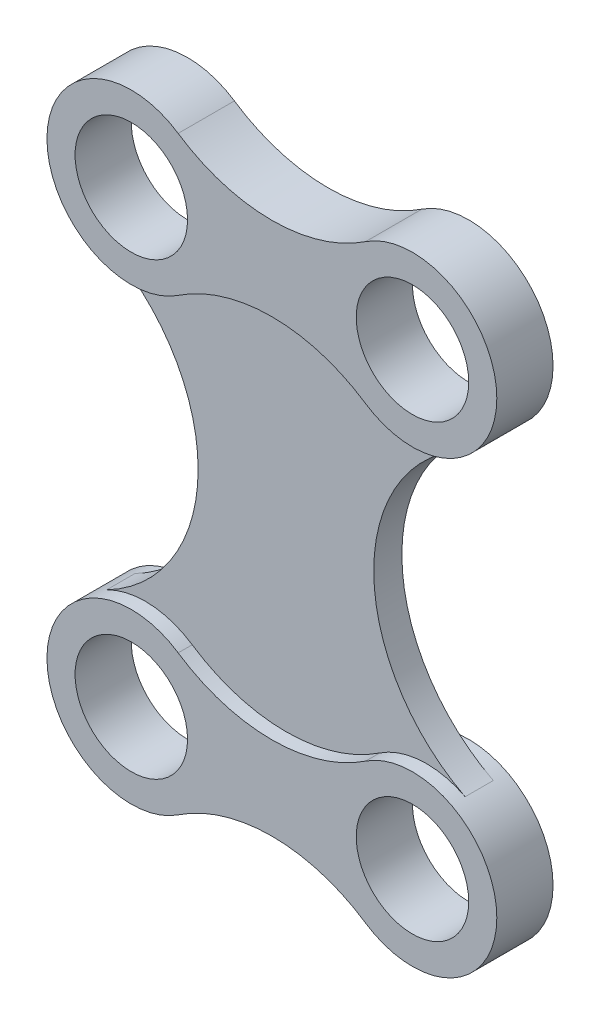
ISO-10303-21;
HEADER;
FILE_DESCRIPTION(('STEP AP214'),'2;1');
FILE_NAME('part.step','',(''),(''),'','','');
FILE_SCHEMA(('AUTOMOTIVE_DESIGN { 1 0 10303 214 1 1 1 1 }'));
ENDSEC;
DATA;
#1=APPLICATION_CONTEXT('core data for automotive mechanical design processes');
#2=APPLICATION_PROTOCOL_DEFINITION('international standard','automotive_design',2000,#1);
#3=PRODUCT_CONTEXT('',#1,'mechanical');
#4=PRODUCT('Part','Part','',(#3));
#5=PRODUCT_RELATED_PRODUCT_CATEGORY('part','',(#4));
#6=PRODUCT_DEFINITION_FORMATION('','',#4);
#7=PRODUCT_DEFINITION_CONTEXT('part definition',#1,'design');
#8=PRODUCT_DEFINITION('design','',#6,#7);
#9=PRODUCT_DEFINITION_SHAPE('','',#8);
#10=(LENGTH_UNIT() NAMED_UNIT(*) SI_UNIT(.MILLI.,.METRE.));
#11=(NAMED_UNIT(*) PLANE_ANGLE_UNIT() SI_UNIT($,.RADIAN.));
#12=(NAMED_UNIT(*) SI_UNIT($,.STERADIAN.) SOLID_ANGLE_UNIT());
#13=UNCERTAINTY_MEASURE_WITH_UNIT(LENGTH_MEASURE(1.E-05),#10,'distance_accuracy_value','');
#14=(GEOMETRIC_REPRESENTATION_CONTEXT(3) GLOBAL_UNCERTAINTY_ASSIGNED_CONTEXT((#13)) GLOBAL_UNIT_ASSIGNED_CONTEXT((#10,
#11,#12)) REPRESENTATION_CONTEXT('',''));
#15=CARTESIAN_POINT('',(0.,0.,0.));
#16=DIRECTION('',(0.,0.,1.));
#17=DIRECTION('',(1.,0.,0.));
#18=AXIS2_PLACEMENT_3D('',#15,#16,#17);
#19=CARTESIAN_POINT('',(0.,2.5834261322606,5.));
#20=DIRECTION('',(0.,0.,-1.));
#21=DIRECTION('',(-1.,0.,0.));
#22=AXIS2_PLACEMENT_3D('',#19,#20,#21);
#23=CYLINDRICAL_SURFACE('',#22,30.);
#24=CARTESIAN_POINT('',(0.,2.5834261322606,-2.5));
#25=DIRECTION('',(0.,0.,1.));
#26=DIRECTION('',(1.,0.,0.));
#27=AXIS2_PLACEMENT_3D('',#24,#25,#26);
#28=CIRCLE('',#27,30.);
#29=CARTESIAN_POINT('',(-16.6666666666667,27.5278087107535,-2.5));
#30=VERTEX_POINT('',#29);
#31=CARTESIAN_POINT('',(16.6666666666667,27.5278087107535,-2.5));
#32=VERTEX_POINT('',#31);
#33=EDGE_CURVE('E265',#30,#32,#28,.F.);
#34=ORIENTED_EDGE('',*,*,#33,.F.);
#35=DIRECTION('',(0.,0.,-1.));
#36=VECTOR('',#35,1.);
#37=CARTESIAN_POINT('',(-16.6666666666667,27.5278087107535,5.));
#38=LINE('',#37,#36);
#39=CARTESIAN_POINT('',(-16.6666666666667,27.5278087107535,-5.));
#40=VERTEX_POINT('',#39);
#41=EDGE_CURVE('E52',#30,#40,#38,.T.);
#42=ORIENTED_EDGE('',*,*,#41,.T.);
#43=CARTESIAN_POINT('',(0.,2.5834261322606,-5.));
#44=DIRECTION('',(0.,0.,1.));
#45=DIRECTION('',(1.,0.,0.));
#46=AXIS2_PLACEMENT_3D('',#43,#44,#45);
#47=CIRCLE('',#46,30.);
#48=CARTESIAN_POINT('',(16.6666666666667,27.5278087107535,-5.));
#49=VERTEX_POINT('',#48);
#50=EDGE_CURVE('E332',#40,#49,#47,.F.);
#51=ORIENTED_EDGE('',*,*,#50,.T.);
#52=DIRECTION('',(0.,0.,-1.));
#53=VECTOR('',#52,1.);
#54=CARTESIAN_POINT('',(16.6666666666667,27.5278087107535,5.));
#55=LINE('',#54,#53);
#56=EDGE_CURVE('E347',#32,#49,#55,.T.);
#57=ORIENTED_EDGE('',*,*,#56,.F.);
#58=EDGE_LOOP('',(#34,#42,#51,#57));
#59=FACE_BOUND('',#58,.T.);
#60=ADVANCED_FACE('F43',(#59),#23,.F.);
#61=CARTESIAN_POINT('',(-25.,40.,5.));
#62=DIRECTION('',(0.,0.,-1.));
#63=DIRECTION('',(-1.,0.,0.));
#64=AXIS2_PLACEMENT_3D('',#61,#62,#63);
#65=CYLINDRICAL_SURFACE('',#64,15.);
#66=DIRECTION('',(0.,0.,-1.));
#67=VECTOR('',#66,1.);
#68=CARTESIAN_POINT('',(-31.8718427093628,26.6666666666667,2.5));
#69=LINE('',#68,#67);
#70=CARTESIAN_POINT('',(-31.8718427093628,26.6666666666667,2.5));
#71=VERTEX_POINT('',#70);
#72=CARTESIAN_POINT('',(-31.8718427093628,26.6666666666667,-2.5));
#73=VERTEX_POINT('',#72);
#74=EDGE_CURVE('E59',#71,#73,#69,.T.);
#75=ORIENTED_EDGE('',*,*,#74,.F.);
#76=CARTESIAN_POINT('',(-25.,40.,2.5));
#77=DIRECTION('',(0.,0.,1.));
#78=DIRECTION('',(1.,0.,0.));
#79=AXIS2_PLACEMENT_3D('',#76,#77,#78);
#80=CIRCLE('',#79,15.);
#81=CARTESIAN_POINT('',(-16.6666666666667,27.5278087107535,2.5));
#82=VERTEX_POINT('',#81);
#83=EDGE_CURVE('E243',#71,#82,#80,.T.);
#84=ORIENTED_EDGE('',*,*,#83,.T.);
#85=CARTESIAN_POINT('',(-16.6666666666667,27.5278087107535,5.));
#86=VERTEX_POINT('',#85);
#87=EDGE_CURVE('E11',#86,#82,#38,.T.);
#88=ORIENTED_EDGE('',*,*,#87,.F.);
#89=CARTESIAN_POINT('',(-25.,40.,5.));
#90=DIRECTION('',(0.,0.,1.));
#91=DIRECTION('',(1.,0.,0.));
#92=AXIS2_PLACEMENT_3D('',#89,#90,#91);
#93=CIRCLE('',#92,15.);
#94=CARTESIAN_POINT('',(-16.6666666666667,52.4721912892465,5.));
#95=VERTEX_POINT('',#94);
#96=EDGE_CURVE('E306',#95,#86,#93,.T.);
#97=ORIENTED_EDGE('',*,*,#96,.F.);
#98=DIRECTION('',(0.,0.,-1.));
#99=VECTOR('',#98,1.);
#100=CARTESIAN_POINT('',(-16.6666666666667,52.4721912892465,5.));
#101=LINE('',#100,#99);
#102=CARTESIAN_POINT('',(-16.6666666666667,52.4721912892465,-5.));
#103=VERTEX_POINT('',#102);
#104=EDGE_CURVE('E320',#95,#103,#101,.T.);
#105=ORIENTED_EDGE('',*,*,#104,.T.);
#106=CARTESIAN_POINT('',(-25.,40.,-5.));
#107=DIRECTION('',(0.,0.,1.));
#108=DIRECTION('',(1.,0.,0.));
#109=AXIS2_PLACEMENT_3D('',#106,#107,#108);
#110=CIRCLE('',#109,15.);
#111=EDGE_CURVE('E328',#103,#40,#110,.T.);
#112=ORIENTED_EDGE('',*,*,#111,.T.);
#113=ORIENTED_EDGE('',*,*,#41,.F.);
#114=CARTESIAN_POINT('',(-25.,40.,-2.5));
#115=DIRECTION('',(0.,0.,1.));
#116=DIRECTION('',(1.,0.,0.));
#117=AXIS2_PLACEMENT_3D('',#114,#115,#116);
#118=CIRCLE('',#117,15.);
#119=EDGE_CURVE('E64',#73,#30,#118,.T.);
#120=ORIENTED_EDGE('',*,*,#119,.F.);
#121=EDGE_LOOP('',(#75,#84,#88,#97,#105,#112,#113,#120));
#122=FACE_BOUND('',#121,.T.);
#123=ADVANCED_FACE('F388',(#122),#65,.T.);
#124=ORIENTED_EDGE('',*,*,#87,.T.);
#125=CARTESIAN_POINT('',(0.,2.5834261322606,2.5));
#126=DIRECTION('',(0.,0.,1.));
#127=DIRECTION('',(1.,0.,0.));
#128=AXIS2_PLACEMENT_3D('',#125,#126,#127);
#129=CIRCLE('',#128,30.);
#130=CARTESIAN_POINT('',(16.6666666666667,27.5278087107535,2.5));
#131=VERTEX_POINT('',#130);
#132=EDGE_CURVE('E240',#82,#131,#129,.F.);
#133=ORIENTED_EDGE('',*,*,#132,.T.);
#134=CARTESIAN_POINT('',(16.6666666666667,27.5278087107535,5.));
#135=VERTEX_POINT('',#134);
#136=EDGE_CURVE('E348',#135,#131,#55,.T.);
#137=ORIENTED_EDGE('',*,*,#136,.F.);
#138=CARTESIAN_POINT('',(0.,2.5834261322606,5.));
#139=DIRECTION('',(0.,0.,1.));
#140=DIRECTION('',(1.,0.,0.));
#141=AXIS2_PLACEMENT_3D('',#138,#139,#140);
#142=CIRCLE('',#141,30.);
#143=EDGE_CURVE('E310',#86,#135,#142,.F.);
#144=ORIENTED_EDGE('',*,*,#143,.F.);
#145=EDGE_LOOP('',(#124,#133,#137,#144));
#146=FACE_BOUND('',#145,.T.);
#147=ADVANCED_FACE('F375',(#146),#23,.F.);
#148=CARTESIAN_POINT('',(25.,40.,5.));
#149=DIRECTION('',(0.,0.,-1.));
#150=DIRECTION('',(-1.,0.,0.));
#151=AXIS2_PLACEMENT_3D('',#148,#149,#150);
#152=CYLINDRICAL_SURFACE('',#151,15.);
#153=ORIENTED_EDGE('',*,*,#136,.T.);
#154=CARTESIAN_POINT('',(25.,40.,2.5));
#155=DIRECTION('',(0.,0.,1.));
#156=DIRECTION('',(1.,0.,0.));
#157=AXIS2_PLACEMENT_3D('',#154,#155,#156);
#158=CIRCLE('',#157,15.);
#159=CARTESIAN_POINT('',(31.8718427093628,26.6666666666667,2.5));
#160=VERTEX_POINT('',#159);
#161=EDGE_CURVE('E236',#131,#160,#158,.T.);
#162=ORIENTED_EDGE('',*,*,#161,.T.);
#163=DIRECTION('',(0.,0.,-1.));
#164=VECTOR('',#163,1.);
#165=CARTESIAN_POINT('',(31.8718427093628,26.6666666666667,2.5));
#166=LINE('',#165,#164);
#167=CARTESIAN_POINT('',(31.8718427093628,26.6666666666667,-2.5));
#168=VERTEX_POINT('',#167);
#169=EDGE_CURVE('E293',#160,#168,#166,.T.);
#170=ORIENTED_EDGE('',*,*,#169,.T.);
#171=CARTESIAN_POINT('',(25.,40.,-2.5));
#172=DIRECTION('',(0.,0.,1.));
#173=DIRECTION('',(1.,0.,0.));
#174=AXIS2_PLACEMENT_3D('',#171,#172,#173);
#175=CIRCLE('',#174,15.);
#176=EDGE_CURVE('E261',#32,#168,#175,.T.);
#177=ORIENTED_EDGE('',*,*,#176,.F.);
#178=ORIENTED_EDGE('',*,*,#56,.T.);
#179=CARTESIAN_POINT('',(25.,40.,-5.));
#180=DIRECTION('',(0.,0.,1.));
#181=DIRECTION('',(1.,0.,0.));
#182=AXIS2_PLACEMENT_3D('',#179,#180,#181);
#183=CIRCLE('',#182,15.);
#184=CARTESIAN_POINT('',(16.6666666666667,52.4721912892465,-5.));
#185=VERTEX_POINT('',#184);
#186=EDGE_CURVE('E336',#49,#185,#183,.T.);
#187=ORIENTED_EDGE('',*,*,#186,.T.);
#188=DIRECTION('',(0.,0.,-1.));
#189=VECTOR('',#188,1.);
#190=CARTESIAN_POINT('',(16.6666666666667,52.4721912892465,5.));
#191=LINE('',#190,#189);
#192=CARTESIAN_POINT('',(16.6666666666667,52.4721912892465,5.));
#193=VERTEX_POINT('',#192);
#194=EDGE_CURVE('E345',#193,#185,#191,.T.);
#195=ORIENTED_EDGE('',*,*,#194,.F.);
#196=CARTESIAN_POINT('',(25.,40.,5.));
#197=DIRECTION('',(0.,0.,1.));
#198=DIRECTION('',(1.,0.,0.));
#199=AXIS2_PLACEMENT_3D('',#196,#197,#198);
#200=CIRCLE('',#199,15.);
#201=EDGE_CURVE('E313',#135,#193,#200,.T.);
#202=ORIENTED_EDGE('',*,*,#201,.F.);
#203=EDGE_LOOP('',(#153,#162,#170,#177,#178,#187,#195,#202));
#204=FACE_BOUND('',#203,.T.);
#205=ADVANCED_FACE('F358',(#204),#152,.T.);
#206=CARTESIAN_POINT('',(25.,40.,5.));
#207=DIRECTION('',(0.,0.,-1.));
#208=DIRECTION('',(-1.,0.,0.));
#209=AXIS2_PLACEMENT_3D('',#206,#207,#208);
#210=CYLINDRICAL_SURFACE('',#209,10.);
#211=CARTESIAN_POINT('',(25.,40.,5.));
#212=DIRECTION('',(0.,0.,1.));
#213=DIRECTION('',(1.,0.,0.));
#214=AXIS2_PLACEMENT_3D('',#211,#212,#213);
#215=CIRCLE('',#214,10.);
#216=CARTESIAN_POINT('',(35.,40.,5.));
#217=VERTEX_POINT('',#216);
#218=EDGE_CURVE('E301',#217,#217,#215,.T.);
#219=ORIENTED_EDGE('',*,*,#218,.T.);
#220=EDGE_LOOP('',(#219));
#221=FACE_BOUND('',#220,.T.);
#222=CARTESIAN_POINT('',(25.,40.,-5.));
#223=DIRECTION('',(0.,0.,1.));
#224=DIRECTION('',(1.,0.,0.));
#225=AXIS2_PLACEMENT_3D('',#222,#223,#224);
#226=CIRCLE('',#225,10.);
#227=CARTESIAN_POINT('',(35.,40.,-5.));
#228=VERTEX_POINT('',#227);
#229=EDGE_CURVE('E324',#228,#228,#226,.T.);
#230=ORIENTED_EDGE('',*,*,#229,.F.);
#231=EDGE_LOOP('',(#230));
#232=FACE_BOUND('',#231,.T.);
#233=ADVANCED_FACE('F397',(#221,#232),#210,.F.);
#234=CARTESIAN_POINT('',(-25.,40.,5.));
#235=DIRECTION('',(0.,0.,-1.));
#236=DIRECTION('',(-1.,0.,0.));
#237=AXIS2_PLACEMENT_3D('',#234,#235,#236);
#238=CYLINDRICAL_SURFACE('',#237,10.);
#239=CARTESIAN_POINT('',(-25.,40.,5.));
#240=DIRECTION('',(0.,0.,1.));
#241=DIRECTION('',(1.,0.,0.));
#242=AXIS2_PLACEMENT_3D('',#239,#240,#241);
#243=CIRCLE('',#242,10.);
#244=CARTESIAN_POINT('',(-15.,40.,5.));
#245=VERTEX_POINT('',#244);
#246=EDGE_CURVE('E297',#245,#245,#243,.T.);
#247=ORIENTED_EDGE('',*,*,#246,.T.);
#248=EDGE_LOOP('',(#247));
#249=FACE_BOUND('',#248,.T.);
#250=CARTESIAN_POINT('',(-25.,40.,-5.));
#251=DIRECTION('',(0.,0.,1.));
#252=DIRECTION('',(1.,0.,0.));
#253=AXIS2_PLACEMENT_3D('',#250,#251,#252);
#254=CIRCLE('',#253,10.);
#255=CARTESIAN_POINT('',(-15.,40.,-5.));
#256=VERTEX_POINT('',#255);
#257=EDGE_CURVE('E296',#256,#256,#254,.T.);
#258=ORIENTED_EDGE('',*,*,#257,.F.);
#259=EDGE_LOOP('',(#258));
#260=FACE_BOUND('',#259,.T.);
#261=ADVANCED_FACE('F45',(#249,#260),#238,.F.);
#262=CARTESIAN_POINT('',(0.,77.4165738677394,5.));
#263=DIRECTION('',(0.,0.,-1.));
#264=DIRECTION('',(-1.,0.,0.));
#265=AXIS2_PLACEMENT_3D('',#262,#263,#264);
#266=CYLINDRICAL_SURFACE('',#265,30.);
#267=CARTESIAN_POINT('',(0.,77.4165738677394,-5.));
#268=DIRECTION('',(0.,0.,1.));
#269=DIRECTION('',(1.,0.,0.));
#270=AXIS2_PLACEMENT_3D('',#267,#268,#269);
#271=CIRCLE('',#270,30.);
#272=EDGE_CURVE('E302',#103,#185,#271,.T.);
#273=ORIENTED_EDGE('',*,*,#272,.F.);
#274=ORIENTED_EDGE('',*,*,#104,.F.);
#275=CARTESIAN_POINT('',(0.,77.4165738677394,5.));
#276=DIRECTION('',(0.,0.,1.));
#277=DIRECTION('',(1.,0.,0.));
#278=AXIS2_PLACEMENT_3D('',#275,#276,#277);
#279=CIRCLE('',#278,30.);
#280=EDGE_CURVE('E316',#95,#193,#279,.T.);
#281=ORIENTED_EDGE('',*,*,#280,.T.);
#282=ORIENTED_EDGE('',*,*,#194,.T.);
#283=EDGE_LOOP('',(#273,#274,#281,#282));
#284=FACE_BOUND('',#283,.T.);
#285=ADVANCED_FACE('F368',(#284),#266,.F.);
#286=CARTESIAN_POINT('',(0.,0.,5.));
#287=DIRECTION('',(0.,0.,1.));
#288=DIRECTION('',(1.,0.,0.));
#289=AXIS2_PLACEMENT_3D('',#286,#287,#288);
#290=PLANE('',#289);
#291=ORIENTED_EDGE('',*,*,#246,.F.);
#292=EDGE_LOOP('',(#291));
#293=FACE_BOUND('',#292,.T.);
#294=ORIENTED_EDGE('',*,*,#218,.F.);
#295=EDGE_LOOP('',(#294));
#296=FACE_BOUND('',#295,.T.);
#297=ORIENTED_EDGE('',*,*,#96,.T.);
#298=ORIENTED_EDGE('',*,*,#143,.T.);
#299=ORIENTED_EDGE('',*,*,#201,.T.);
#300=ORIENTED_EDGE('',*,*,#280,.F.);
#301=EDGE_LOOP('',(#297,#298,#299,#300));
#302=FACE_BOUND('',#301,.T.);
#303=ADVANCED_FACE('F372',(#293,#296,#302),#290,.T.);
#304=CARTESIAN_POINT('',(0.,0.,-5.));
#305=DIRECTION('',(0.,0.,1.));
#306=DIRECTION('',(1.,0.,0.));
#307=AXIS2_PLACEMENT_3D('',#304,#305,#306);
#308=PLANE('',#307);
#309=ORIENTED_EDGE('',*,*,#257,.T.);
#310=EDGE_LOOP('',(#309));
#311=FACE_BOUND('',#310,.T.);
#312=ORIENTED_EDGE('',*,*,#229,.T.);
#313=EDGE_LOOP('',(#312));
#314=FACE_BOUND('',#313,.T.);
#315=ORIENTED_EDGE('',*,*,#111,.F.);
#316=ORIENTED_EDGE('',*,*,#272,.T.);
#317=ORIENTED_EDGE('',*,*,#186,.F.);
#318=ORIENTED_EDGE('',*,*,#50,.F.);
#319=EDGE_LOOP('',(#315,#316,#317,#318));
#320=FACE_BOUND('',#319,.T.);
#321=ADVANCED_FACE('F365',(#311,#314,#320),#308,.F.);
#322=CARTESIAN_POINT('',(45.6155281280883,0.,2.5));
#323=DIRECTION('',(0.,0.,-1.));
#324=DIRECTION('',(-1.,0.,0.));
#325=AXIS2_PLACEMENT_3D('',#322,#323,#324);
#326=CYLINDRICAL_SURFACE('',#325,30.);
#327=CARTESIAN_POINT('',(45.6155281280883,0.,-2.5));
#328=DIRECTION('',(0.,0.,1.));
#329=DIRECTION('',(1.,0.,0.));
#330=AXIS2_PLACEMENT_3D('',#327,#328,#329);
#331=CIRCLE('',#330,30.);
#332=CARTESIAN_POINT('',(31.8718427093628,-26.6666666666667,-2.5));
#333=VERTEX_POINT('',#332);
#334=EDGE_CURVE('E167',#168,#333,#331,.T.);
#335=ORIENTED_EDGE('',*,*,#334,.F.);
#336=ORIENTED_EDGE('',*,*,#169,.F.);
#337=CARTESIAN_POINT('',(45.6155281280883,0.,2.5));
#338=DIRECTION('',(0.,0.,1.));
#339=DIRECTION('',(1.,0.,0.));
#340=AXIS2_PLACEMENT_3D('',#337,#338,#339);
#341=CIRCLE('',#340,30.);
#342=CARTESIAN_POINT('',(31.8718427093628,-26.6666666666667,2.5));
#343=VERTEX_POINT('',#342);
#344=EDGE_CURVE('E232',#160,#343,#341,.T.);
#345=ORIENTED_EDGE('',*,*,#344,.T.);
#346=DIRECTION('',(0.,0.,-1.));
#347=VECTOR('',#346,1.);
#348=CARTESIAN_POINT('',(31.8718427093628,-26.6666666666667,2.5));
#349=LINE('',#348,#347);
#350=EDGE_CURVE('E257',#343,#333,#349,.T.);
#351=ORIENTED_EDGE('',*,*,#350,.T.);
#352=EDGE_LOOP('',(#335,#336,#345,#351));
#353=FACE_BOUND('',#352,.T.);
#354=ADVANCED_FACE('F384',(#353),#326,.F.);
#355=CARTESIAN_POINT('',(-45.6155281280883,0.,2.5));
#356=DIRECTION('',(0.,0.,-1.));
#357=DIRECTION('',(-1.,0.,0.));
#358=AXIS2_PLACEMENT_3D('',#355,#356,#357);
#359=CYLINDRICAL_SURFACE('',#358,30.);
#360=CARTESIAN_POINT('',(-45.6155281280883,0.,-2.5));
#361=DIRECTION('',(0.,0.,1.));
#362=DIRECTION('',(1.,0.,0.));
#363=AXIS2_PLACEMENT_3D('',#360,#361,#362);
#364=CIRCLE('',#363,30.);
#365=CARTESIAN_POINT('',(-31.8718427093628,-26.6666666666667,-2.5));
#366=VERTEX_POINT('',#365);
#367=EDGE_CURVE('E271',#73,#366,#364,.F.);
#368=ORIENTED_EDGE('',*,*,#367,.T.);
#369=DIRECTION('',(0.,0.,-1.));
#370=VECTOR('',#369,1.);
#371=CARTESIAN_POINT('',(-31.8718427093628,-26.6666666666667,2.5));
#372=LINE('',#371,#370);
#373=CARTESIAN_POINT('',(-31.8718427093628,-26.6666666666667,2.5));
#374=VERTEX_POINT('',#373);
#375=EDGE_CURVE('E287',#374,#366,#372,.T.);
#376=ORIENTED_EDGE('',*,*,#375,.F.);
#377=CARTESIAN_POINT('',(-45.6155281280883,0.,2.5));
#378=DIRECTION('',(0.,0.,1.));
#379=DIRECTION('',(1.,0.,0.));
#380=AXIS2_PLACEMENT_3D('',#377,#378,#379);
#381=CIRCLE('',#380,30.);
#382=EDGE_CURVE('E246',#71,#374,#381,.F.);
#383=ORIENTED_EDGE('',*,*,#382,.F.);
#384=ORIENTED_EDGE('',*,*,#74,.T.);
#385=EDGE_LOOP('',(#368,#376,#383,#384));
#386=FACE_BOUND('',#385,.T.);
#387=ADVANCED_FACE('F416',(#386),#359,.F.);
#388=CARTESIAN_POINT('',(0.,0.,2.5));
#389=DIRECTION('',(0.,0.,1.));
#390=DIRECTION('',(1.,0.,0.));
#391=AXIS2_PLACEMENT_3D('',#388,#389,#390);
#392=PLANE('',#391);
#393=ORIENTED_EDGE('',*,*,#344,.F.);
#394=ORIENTED_EDGE('',*,*,#161,.F.);
#395=ORIENTED_EDGE('',*,*,#132,.F.);
#396=ORIENTED_EDGE('',*,*,#83,.F.);
#397=ORIENTED_EDGE('',*,*,#382,.T.);
#398=CARTESIAN_POINT('',(-25.,-40.,2.5));
#399=DIRECTION('',(0.,0.,1.));
#400=DIRECTION('',(1.,0.,0.));
#401=AXIS2_PLACEMENT_3D('',#398,#399,#400);
#402=CIRCLE('',#401,15.);
#403=CARTESIAN_POINT('',(-16.6666666666667,-27.5278087107535,2.5));
#404=VERTEX_POINT('',#403);
#405=EDGE_CURVE('E249',#374,#404,#402,.F.);
#406=ORIENTED_EDGE('',*,*,#405,.T.);
#407=CARTESIAN_POINT('',(0.,-2.5834261322606,2.5));
#408=DIRECTION('',(0.,0.,1.));
#409=DIRECTION('',(1.,0.,0.));
#410=AXIS2_PLACEMENT_3D('',#407,#408,#409);
#411=CIRCLE('',#410,30.);
#412=CARTESIAN_POINT('',(16.6666666666667,-27.5278087107536,2.5));
#413=VERTEX_POINT('',#412);
#414=EDGE_CURVE('E252',#404,#413,#411,.T.);
#415=ORIENTED_EDGE('',*,*,#414,.T.);
#416=CARTESIAN_POINT('',(25.,-40.,2.5));
#417=DIRECTION('',(0.,0.,1.));
#418=DIRECTION('',(1.,0.,0.));
#419=AXIS2_PLACEMENT_3D('',#416,#417,#418);
#420=CIRCLE('',#419,15.);
#421=EDGE_CURVE('E162',#413,#343,#420,.F.);
#422=ORIENTED_EDGE('',*,*,#421,.T.);
#423=EDGE_LOOP('',(#393,#394,#395,#396,#397,#406,#415,#422));
#424=FACE_BOUND('',#423,.T.);
#425=ADVANCED_FACE('F380',(#424),#392,.T.);
#426=CARTESIAN_POINT('',(0.,0.,-2.5));
#427=DIRECTION('',(0.,0.,1.));
#428=DIRECTION('',(1.,0.,0.));
#429=AXIS2_PLACEMENT_3D('',#426,#427,#428);
#430=PLANE('',#429);
#431=ORIENTED_EDGE('',*,*,#334,.T.);
#432=CARTESIAN_POINT('',(25.,-40.,-2.5));
#433=DIRECTION('',(0.,0.,1.));
#434=DIRECTION('',(1.,0.,0.));
#435=AXIS2_PLACEMENT_3D('',#432,#433,#434);
#436=CIRCLE('',#435,15.);
#437=CARTESIAN_POINT('',(16.6666666666667,-27.5278087107536,-2.5));
#438=VERTEX_POINT('',#437);
#439=EDGE_CURVE('E237',#438,#333,#436,.F.);
#440=ORIENTED_EDGE('',*,*,#439,.F.);
#441=CARTESIAN_POINT('',(0.,-2.5834261322606,-2.5));
#442=DIRECTION('',(0.,0.,1.));
#443=DIRECTION('',(1.,0.,0.));
#444=AXIS2_PLACEMENT_3D('',#441,#442,#443);
#445=CIRCLE('',#444,30.);
#446=CARTESIAN_POINT('',(-16.6666666666667,-27.5278087107535,-2.5));
#447=VERTEX_POINT('',#446);
#448=EDGE_CURVE('E278',#447,#438,#445,.T.);
#449=ORIENTED_EDGE('',*,*,#448,.F.);
#450=CARTESIAN_POINT('',(-25.,-40.,-2.5));
#451=DIRECTION('',(0.,0.,1.));
#452=DIRECTION('',(1.,0.,0.));
#453=AXIS2_PLACEMENT_3D('',#450,#451,#452);
#454=CIRCLE('',#453,15.);
#455=EDGE_CURVE('E274',#366,#447,#454,.F.);
#456=ORIENTED_EDGE('',*,*,#455,.F.);
#457=ORIENTED_EDGE('',*,*,#367,.F.);
#458=ORIENTED_EDGE('',*,*,#119,.T.);
#459=ORIENTED_EDGE('',*,*,#33,.T.);
#460=ORIENTED_EDGE('',*,*,#176,.T.);
#461=EDGE_LOOP('',(#431,#440,#449,#456,#457,#458,#459,#460));
#462=FACE_BOUND('',#461,.T.);
#463=ADVANCED_FACE('F386',(#462),#430,.F.);
#464=CARTESIAN_POINT('',(0.,-2.5834261322606,5.));
#465=DIRECTION('',(0.,0.,-1.));
#466=DIRECTION('',(-1.,0.,0.));
#467=AXIS2_PLACEMENT_3D('',#464,#465,#466);
#468=CYLINDRICAL_SURFACE('',#467,30.);
#469=ORIENTED_EDGE('',*,*,#448,.T.);
#470=DIRECTION('',(0.,0.,-1.));
#471=VECTOR('',#470,1.);
#472=CARTESIAN_POINT('',(16.6666666666667,-27.5278087107536,5.));
#473=LINE('',#472,#471);
#474=CARTESIAN_POINT('',(16.6666666666667,-27.5278087107536,-5.));
#475=VERTEX_POINT('',#474);
#476=EDGE_CURVE('E168',#438,#475,#473,.T.);
#477=ORIENTED_EDGE('',*,*,#476,.T.);
#478=CARTESIAN_POINT('',(0.,-2.5834261322606,-5.));
#479=DIRECTION('',(0.,0.,1.));
#480=DIRECTION('',(1.,0.,0.));
#481=AXIS2_PLACEMENT_3D('',#478,#479,#480);
#482=CIRCLE('',#481,30.);
#483=CARTESIAN_POINT('',(-16.6666666666667,-27.5278087107535,-5.));
#484=VERTEX_POINT('',#483);
#485=EDGE_CURVE('E208',#484,#475,#482,.T.);
#486=ORIENTED_EDGE('',*,*,#485,.F.);
#487=DIRECTION('',(0.,0.,-1.));
#488=VECTOR('',#487,1.);
#489=CARTESIAN_POINT('',(-16.6666666666667,-27.5278087107535,5.));
#490=LINE('',#489,#488);
#491=EDGE_CURVE('E229',#447,#484,#490,.T.);
#492=ORIENTED_EDGE('',*,*,#491,.F.);
#493=EDGE_LOOP('',(#469,#477,#486,#492));
#494=FACE_BOUND('',#493,.T.);
#495=ADVANCED_FACE('F499',(#494),#468,.F.);
#496=CARTESIAN_POINT('',(25.,-40.,5.));
#497=DIRECTION('',(0.,0.,-1.));
#498=DIRECTION('',(-1.,0.,0.));
#499=AXIS2_PLACEMENT_3D('',#496,#497,#498);
#500=CYLINDRICAL_SURFACE('',#499,15.);
#501=ORIENTED_EDGE('',*,*,#350,.F.);
#502=ORIENTED_EDGE('',*,*,#421,.F.);
#503=CARTESIAN_POINT('',(16.6666666666667,-27.5278087107536,5.));
#504=VERTEX_POINT('',#503);
#505=EDGE_CURVE('E157',#504,#413,#473,.T.);
#506=ORIENTED_EDGE('',*,*,#505,.F.);
#507=CARTESIAN_POINT('',(25.,-40.,5.));
#508=DIRECTION('',(0.,0.,1.));
#509=DIRECTION('',(1.,0.,0.));
#510=AXIS2_PLACEMENT_3D('',#507,#508,#509);
#511=CIRCLE('',#510,15.);
#512=CARTESIAN_POINT('',(16.6666666666667,-52.4721912892465,5.));
#513=VERTEX_POINT('',#512);
#514=EDGE_CURVE('E161',#504,#513,#511,.F.);
#515=ORIENTED_EDGE('',*,*,#514,.T.);
#516=DIRECTION('',(0.,0.,-1.));
#517=VECTOR('',#516,1.);
#518=CARTESIAN_POINT('',(16.6666666666667,-52.4721912892465,5.));
#519=LINE('',#518,#517);
#520=CARTESIAN_POINT('',(16.6666666666667,-52.4721912892465,-5.));
#521=VERTEX_POINT('',#520);
#522=EDGE_CURVE('E199',#513,#521,#519,.T.);
#523=ORIENTED_EDGE('',*,*,#522,.T.);
#524=CARTESIAN_POINT('',(25.,-40.,-5.));
#525=DIRECTION('',(0.,0.,1.));
#526=DIRECTION('',(1.,0.,0.));
#527=AXIS2_PLACEMENT_3D('',#524,#525,#526);
#528=CIRCLE('',#527,15.);
#529=EDGE_CURVE('E204',#475,#521,#528,.F.);
#530=ORIENTED_EDGE('',*,*,#529,.F.);
#531=ORIENTED_EDGE('',*,*,#476,.F.);
#532=ORIENTED_EDGE('',*,*,#439,.T.);
#533=EDGE_LOOP('',(#501,#502,#506,#515,#523,#530,#531,#532));
#534=FACE_BOUND('',#533,.T.);
#535=ADVANCED_FACE('F160',(#534),#500,.T.);
#536=ORIENTED_EDGE('',*,*,#505,.T.);
#537=ORIENTED_EDGE('',*,*,#414,.F.);
#538=CARTESIAN_POINT('',(-16.6666666666667,-27.5278087107535,5.));
#539=VERTEX_POINT('',#538);
#540=EDGE_CURVE('E185',#539,#404,#490,.T.);
#541=ORIENTED_EDGE('',*,*,#540,.F.);
#542=CARTESIAN_POINT('',(0.,-2.5834261322606,5.));
#543=DIRECTION('',(0.,0.,1.));
#544=DIRECTION('',(1.,0.,0.));
#545=AXIS2_PLACEMENT_3D('',#542,#543,#544);
#546=CIRCLE('',#545,30.);
#547=EDGE_CURVE('E175',#539,#504,#546,.T.);
#548=ORIENTED_EDGE('',*,*,#547,.T.);
#549=EDGE_LOOP('',(#536,#537,#541,#548));
#550=FACE_BOUND('',#549,.T.);
#551=ADVANCED_FACE('F183',(#550),#468,.F.);
#552=CARTESIAN_POINT('',(-25.,-40.,5.));
#553=DIRECTION('',(0.,0.,-1.));
#554=DIRECTION('',(-1.,0.,0.));
#555=AXIS2_PLACEMENT_3D('',#552,#553,#554);
#556=CYLINDRICAL_SURFACE('',#555,15.);
#557=ORIENTED_EDGE('',*,*,#540,.T.);
#558=ORIENTED_EDGE('',*,*,#405,.F.);
#559=ORIENTED_EDGE('',*,*,#375,.T.);
#560=ORIENTED_EDGE('',*,*,#455,.T.);
#561=ORIENTED_EDGE('',*,*,#491,.T.);
#562=CARTESIAN_POINT('',(-25.,-40.,-5.));
#563=DIRECTION('',(0.,0.,1.));
#564=DIRECTION('',(1.,0.,0.));
#565=AXIS2_PLACEMENT_3D('',#562,#563,#564);
#566=CIRCLE('',#565,15.);
#567=CARTESIAN_POINT('',(-16.6666666666667,-52.4721912892465,-5.));
#568=VERTEX_POINT('',#567);
#569=EDGE_CURVE('E212',#568,#484,#566,.F.);
#570=ORIENTED_EDGE('',*,*,#569,.F.);
#571=DIRECTION('',(0.,0.,-1.));
#572=VECTOR('',#571,1.);
#573=CARTESIAN_POINT('',(-16.6666666666667,-52.4721912892465,5.));
#574=LINE('',#573,#572);
#575=CARTESIAN_POINT('',(-16.6666666666667,-52.4721912892465,5.));
#576=VERTEX_POINT('',#575);
#577=EDGE_CURVE('E226',#576,#568,#574,.T.);
#578=ORIENTED_EDGE('',*,*,#577,.F.);
#579=CARTESIAN_POINT('',(-25.,-40.,5.));
#580=DIRECTION('',(0.,0.,1.));
#581=DIRECTION('',(1.,0.,0.));
#582=AXIS2_PLACEMENT_3D('',#579,#580,#581);
#583=CIRCLE('',#582,15.);
#584=EDGE_CURVE('E187',#576,#539,#583,.F.);
#585=ORIENTED_EDGE('',*,*,#584,.T.);
#586=EDGE_LOOP('',(#557,#558,#559,#560,#561,#570,#578,#585));
#587=FACE_BOUND('',#586,.T.);
#588=ADVANCED_FACE('F526',(#587),#556,.T.);
#589=CARTESIAN_POINT('',(0.,-77.4165738677394,5.));
#590=DIRECTION('',(0.,0.,-1.));
#591=DIRECTION('',(-1.,0.,0.));
#592=AXIS2_PLACEMENT_3D('',#589,#590,#591);
#593=CYLINDRICAL_SURFACE('',#592,30.);
#594=CARTESIAN_POINT('',(0.,-77.4165738677394,-5.));
#595=DIRECTION('',(0.,0.,1.));
#596=DIRECTION('',(1.,0.,0.));
#597=AXIS2_PLACEMENT_3D('',#594,#595,#596);
#598=CIRCLE('',#597,30.);
#599=EDGE_CURVE('E216',#568,#521,#598,.F.);
#600=ORIENTED_EDGE('',*,*,#599,.T.);
#601=ORIENTED_EDGE('',*,*,#522,.F.);
#602=CARTESIAN_POINT('',(0.,-77.4165738677394,5.));
#603=DIRECTION('',(0.,0.,1.));
#604=DIRECTION('',(1.,0.,0.));
#605=AXIS2_PLACEMENT_3D('',#602,#603,#604);
#606=CIRCLE('',#605,30.);
#607=EDGE_CURVE('E178',#576,#513,#606,.F.);
#608=ORIENTED_EDGE('',*,*,#607,.F.);
#609=ORIENTED_EDGE('',*,*,#577,.T.);
#610=EDGE_LOOP('',(#600,#601,#608,#609));
#611=FACE_BOUND('',#610,.T.);
#612=ADVANCED_FACE('F534',(#611),#593,.F.);
#613=CARTESIAN_POINT('',(25.,-40.,5.));
#614=DIRECTION('',(0.,0.,-1.));
#615=DIRECTION('',(-1.,0.,0.));
#616=AXIS2_PLACEMENT_3D('',#613,#614,#615);
#617=CYLINDRICAL_SURFACE('',#616,10.);
#618=CARTESIAN_POINT('',(25.,-40.,5.));
#619=DIRECTION('',(0.,0.,1.));
#620=DIRECTION('',(1.,0.,0.));
#621=AXIS2_PLACEMENT_3D('',#618,#619,#620);
#622=CIRCLE('',#621,10.);
#623=CARTESIAN_POINT('',(35.,-40.,5.));
#624=VERTEX_POINT('',#623);
#625=EDGE_CURVE('E181',#624,#624,#622,.F.);
#626=ORIENTED_EDGE('',*,*,#625,.F.);
#627=EDGE_LOOP('',(#626));
#628=FACE_BOUND('',#627,.T.);
#629=CARTESIAN_POINT('',(25.,-40.,-5.));
#630=DIRECTION('',(0.,0.,1.));
#631=DIRECTION('',(1.,0.,0.));
#632=AXIS2_PLACEMENT_3D('',#629,#630,#631);
#633=CIRCLE('',#632,10.);
#634=CARTESIAN_POINT('',(35.,-40.,-5.));
#635=VERTEX_POINT('',#634);
#636=EDGE_CURVE('E200',#635,#635,#633,.F.);
#637=ORIENTED_EDGE('',*,*,#636,.T.);
#638=EDGE_LOOP('',(#637));
#639=FACE_BOUND('',#638,.T.);
#640=ADVANCED_FACE('F544',(#628,#639),#617,.F.);
#641=CARTESIAN_POINT('',(-25.,-40.,5.));
#642=DIRECTION('',(0.,0.,-1.));
#643=DIRECTION('',(-1.,0.,0.));
#644=AXIS2_PLACEMENT_3D('',#641,#642,#643);
#645=CYLINDRICAL_SURFACE('',#644,10.);
#646=CARTESIAN_POINT('',(-25.,-40.,5.));
#647=DIRECTION('',(0.,0.,1.));
#648=DIRECTION('',(1.,0.,0.));
#649=AXIS2_PLACEMENT_3D('',#646,#647,#648);
#650=CIRCLE('',#649,10.);
#651=CARTESIAN_POINT('',(-15.,-40.,5.));
#652=VERTEX_POINT('',#651);
#653=EDGE_CURVE('E195',#652,#652,#650,.F.);
#654=ORIENTED_EDGE('',*,*,#653,.F.);
#655=EDGE_LOOP('',(#654));
#656=FACE_BOUND('',#655,.T.);
#657=CARTESIAN_POINT('',(-25.,-40.,-5.));
#658=DIRECTION('',(0.,0.,1.));
#659=DIRECTION('',(1.,0.,0.));
#660=AXIS2_PLACEMENT_3D('',#657,#658,#659);
#661=CIRCLE('',#660,10.);
#662=CARTESIAN_POINT('',(-15.,-40.,-5.));
#663=VERTEX_POINT('',#662);
#664=EDGE_CURVE('E220',#663,#663,#661,.F.);
#665=ORIENTED_EDGE('',*,*,#664,.T.);
#666=EDGE_LOOP('',(#665));
#667=FACE_BOUND('',#666,.T.);
#668=ADVANCED_FACE('F554',(#656,#667),#645,.F.);
#669=CARTESIAN_POINT('',(0.,0.,5.));
#670=DIRECTION('',(0.,0.,1.));
#671=DIRECTION('',(1.,0.,0.));
#672=AXIS2_PLACEMENT_3D('',#669,#670,#671);
#673=PLANE('',#672);
#674=ORIENTED_EDGE('',*,*,#625,.T.);
#675=EDGE_LOOP('',(#674));
#676=FACE_BOUND('',#675,.T.);
#677=ORIENTED_EDGE('',*,*,#514,.F.);
#678=ORIENTED_EDGE('',*,*,#547,.F.);
#679=ORIENTED_EDGE('',*,*,#584,.F.);
#680=ORIENTED_EDGE('',*,*,#607,.T.);
#681=EDGE_LOOP('',(#677,#678,#679,#680));
#682=FACE_BOUND('',#681,.T.);
#683=ORIENTED_EDGE('',*,*,#653,.T.);
#684=EDGE_LOOP('',(#683));
#685=FACE_BOUND('',#684,.T.);
#686=ADVANCED_FACE('F172',(#676,#682,#685),#673,.T.);
#687=CARTESIAN_POINT('',(0.,0.,-5.));
#688=DIRECTION('',(0.,0.,1.));
#689=DIRECTION('',(1.,0.,0.));
#690=AXIS2_PLACEMENT_3D('',#687,#688,#689);
#691=PLANE('',#690);
#692=ORIENTED_EDGE('',*,*,#636,.F.);
#693=EDGE_LOOP('',(#692));
#694=FACE_BOUND('',#693,.T.);
#695=ORIENTED_EDGE('',*,*,#529,.T.);
#696=ORIENTED_EDGE('',*,*,#599,.F.);
#697=ORIENTED_EDGE('',*,*,#569,.T.);
#698=ORIENTED_EDGE('',*,*,#485,.T.);
#699=EDGE_LOOP('',(#695,#696,#697,#698));
#700=FACE_BOUND('',#699,.T.);
#701=ORIENTED_EDGE('',*,*,#664,.F.);
#702=EDGE_LOOP('',(#701));
#703=FACE_BOUND('',#702,.T.);
#704=ADVANCED_FACE('F573',(#694,#700,#703),#691,.F.);
#705=CLOSED_SHELL('',(#60,#123,#147,#205,#233,#261,#285,#303,#321,#354,#387,#425,#463,#495,#535,
#551,#588,#612,#640,#668,#686,#704));
#706=MANIFOLD_SOLID_BREP('B2',#705);
#707=ADVANCED_BREP_SHAPE_REPRESENTATION('',(#18,#706),#14);
#708=SHAPE_DEFINITION_REPRESENTATION(#9,#707);
ENDSEC;
END-ISO-10303-21;
